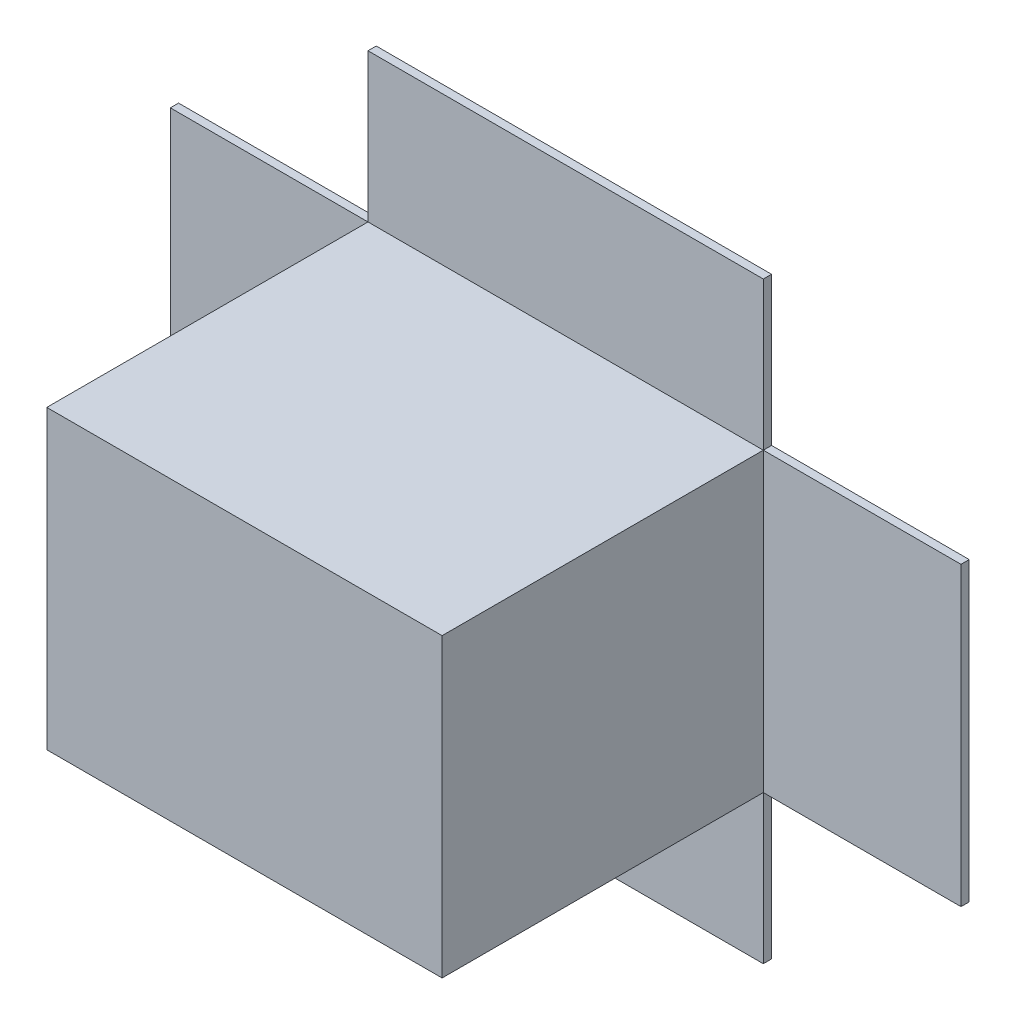
ISO-10303-21;
HEADER;
FILE_DESCRIPTION(('STEP AP214'),'2;1');
FILE_NAME('part.step','',(''),(''),'','','');
FILE_SCHEMA(('AUTOMOTIVE_DESIGN { 1 0 10303 214 1 1 1 1 }'));
ENDSEC;
DATA;
#1=APPLICATION_CONTEXT('core data for automotive mechanical design processes');
#2=APPLICATION_PROTOCOL_DEFINITION('international standard','automotive_design',2000,#1);
#3=PRODUCT_CONTEXT('',#1,'mechanical');
#4=PRODUCT('Part','Part','',(#3));
#5=PRODUCT_RELATED_PRODUCT_CATEGORY('part','',(#4));
#6=PRODUCT_DEFINITION_FORMATION('','',#4);
#7=PRODUCT_DEFINITION_CONTEXT('part definition',#1,'design');
#8=PRODUCT_DEFINITION('design','',#6,#7);
#9=PRODUCT_DEFINITION_SHAPE('','',#8);
#10=(LENGTH_UNIT() NAMED_UNIT(*) SI_UNIT(.MILLI.,.METRE.));
#11=(NAMED_UNIT(*) PLANE_ANGLE_UNIT() SI_UNIT($,.RADIAN.));
#12=(NAMED_UNIT(*) SI_UNIT($,.STERADIAN.) SOLID_ANGLE_UNIT());
#13=UNCERTAINTY_MEASURE_WITH_UNIT(LENGTH_MEASURE(1.E-05),#10,'distance_accuracy_value','');
#14=(GEOMETRIC_REPRESENTATION_CONTEXT(3) GLOBAL_UNCERTAINTY_ASSIGNED_CONTEXT((#13)) GLOBAL_UNIT_ASSIGNED_CONTEXT((#10,
#11,#12)) REPRESENTATION_CONTEXT('',''));
#15=CARTESIAN_POINT('',(0.,0.,0.));
#16=DIRECTION('',(0.,0.,1.));
#17=DIRECTION('',(1.,0.,0.));
#18=AXIS2_PLACEMENT_3D('',#15,#16,#17);
#19=CARTESIAN_POINT('',(0.,0.,0.));
#20=DIRECTION('',(0.,0.,-1.));
#21=DIRECTION('',(-1.,0.,0.));
#22=AXIS2_PLACEMENT_3D('',#19,#20,#21);
#23=PLANE('',#22);
#24=DIRECTION('',(1.,0.,0.));
#25=VECTOR('',#24,1.);
#26=CARTESIAN_POINT('',(-57.5,42.5,0.));
#27=LINE('',#26,#25);
#28=CARTESIAN_POINT('',(-57.5,42.5,0.));
#29=VERTEX_POINT('',#28);
#30=CARTESIAN_POINT('',(57.5,42.5,0.));
#31=VERTEX_POINT('',#30);
#32=EDGE_CURVE('E319',#29,#31,#27,.T.);
#33=ORIENTED_EDGE('',*,*,#32,.F.);
#34=DIRECTION('',(0.,1.,0.));
#35=VECTOR('',#34,1.);
#36=CARTESIAN_POINT('',(-57.5,-42.5,0.));
#37=LINE('',#36,#35);
#38=CARTESIAN_POINT('',(-57.5,-42.5,0.));
#39=VERTEX_POINT('',#38);
#40=EDGE_CURVE('E325',#39,#29,#37,.T.);
#41=ORIENTED_EDGE('',*,*,#40,.F.);
#42=DIRECTION('',(-1.,0.,0.));
#43=VECTOR('',#42,1.);
#44=CARTESIAN_POINT('',(57.5,-42.5,0.));
#45=LINE('',#44,#43);
#46=CARTESIAN_POINT('',(57.5,-42.5,0.));
#47=VERTEX_POINT('',#46);
#48=EDGE_CURVE('E345',#47,#39,#45,.T.);
#49=ORIENTED_EDGE('',*,*,#48,.F.);
#50=DIRECTION('',(0.,-1.,0.));
#51=VECTOR('',#50,1.);
#52=CARTESIAN_POINT('',(57.5,42.5,0.));
#53=LINE('',#52,#51);
#54=EDGE_CURVE('E341',#31,#47,#53,.T.);
#55=ORIENTED_EDGE('',*,*,#54,.F.);
#56=EDGE_LOOP('',(#33,#41,#49,#55));
#57=FACE_BOUND('',#56,.T.);
#58=DIRECTION('',(0.,1.,0.));
#59=VECTOR('',#58,1.);
#60=CARTESIAN_POINT('',(60.,0.,0.));
#61=LINE('',#60,#59);
#62=CARTESIAN_POINT('',(60.,45.,0.));
#63=VERTEX_POINT('',#62);
#64=CARTESIAN_POINT('',(60.,90.,0.));
#65=VERTEX_POINT('',#64);
#66=EDGE_CURVE('E201',#63,#65,#61,.T.);
#67=ORIENTED_EDGE('',*,*,#66,.F.);
#68=DIRECTION('',(1.,0.,0.));
#69=VECTOR('',#68,1.);
#70=CARTESIAN_POINT('',(0.,45.,0.));
#71=LINE('',#70,#69);
#72=CARTESIAN_POINT('',(120.,45.,0.));
#73=VERTEX_POINT('',#72);
#74=EDGE_CURVE('E197',#63,#73,#71,.T.);
#75=ORIENTED_EDGE('',*,*,#74,.T.);
#76=DIRECTION('',(0.,1.,0.));
#77=VECTOR('',#76,1.);
#78=CARTESIAN_POINT('',(120.,0.,0.));
#79=LINE('',#78,#77);
#80=CARTESIAN_POINT('',(120.,-45.,0.));
#81=VERTEX_POINT('',#80);
#82=EDGE_CURVE('E236',#81,#73,#79,.T.);
#83=ORIENTED_EDGE('',*,*,#82,.F.);
#84=DIRECTION('',(1.,0.,0.));
#85=VECTOR('',#84,1.);
#86=CARTESIAN_POINT('',(0.,-45.,0.));
#87=LINE('',#86,#85);
#88=CARTESIAN_POINT('',(60.,-45.,0.));
#89=VERTEX_POINT('',#88);
#90=EDGE_CURVE('E185',#89,#81,#87,.T.);
#91=ORIENTED_EDGE('',*,*,#90,.F.);
#92=DIRECTION('',(0.,-1.,0.));
#93=VECTOR('',#92,1.);
#94=CARTESIAN_POINT('',(60.,0.,0.));
#95=LINE('',#94,#93);
#96=CARTESIAN_POINT('',(60.,-90.,0.));
#97=VERTEX_POINT('',#96);
#98=EDGE_CURVE('E241',#89,#97,#95,.T.);
#99=ORIENTED_EDGE('',*,*,#98,.T.);
#100=DIRECTION('',(-1.,0.,0.));
#101=VECTOR('',#100,1.);
#102=CARTESIAN_POINT('',(0.,-90.,0.));
#103=LINE('',#102,#101);
#104=CARTESIAN_POINT('',(-60.,-90.,0.));
#105=VERTEX_POINT('',#104);
#106=EDGE_CURVE('E245',#97,#105,#103,.T.);
#107=ORIENTED_EDGE('',*,*,#106,.T.);
#108=DIRECTION('',(0.,-1.,0.));
#109=VECTOR('',#108,1.);
#110=CARTESIAN_POINT('',(-60.,0.,0.));
#111=LINE('',#110,#109);
#112=CARTESIAN_POINT('',(-60.,-45.,0.));
#113=VERTEX_POINT('',#112);
#114=EDGE_CURVE('E249',#113,#105,#111,.T.);
#115=ORIENTED_EDGE('',*,*,#114,.F.);
#116=DIRECTION('',(-1.,0.,0.));
#117=VECTOR('',#116,1.);
#118=CARTESIAN_POINT('',(0.,-45.,0.));
#119=LINE('',#118,#117);
#120=CARTESIAN_POINT('',(-120.,-45.,0.));
#121=VERTEX_POINT('',#120);
#122=EDGE_CURVE('E253',#113,#121,#119,.T.);
#123=ORIENTED_EDGE('',*,*,#122,.T.);
#124=DIRECTION('',(0.,-1.,0.));
#125=VECTOR('',#124,1.);
#126=CARTESIAN_POINT('',(-120.,0.,0.));
#127=LINE('',#126,#125);
#128=CARTESIAN_POINT('',(-120.,45.,0.));
#129=VERTEX_POINT('',#128);
#130=EDGE_CURVE('E257',#129,#121,#127,.T.);
#131=ORIENTED_EDGE('',*,*,#130,.F.);
#132=DIRECTION('',(-1.,0.,0.));
#133=VECTOR('',#132,1.);
#134=CARTESIAN_POINT('',(0.,45.,0.));
#135=LINE('',#134,#133);
#136=CARTESIAN_POINT('',(-60.,45.,0.));
#137=VERTEX_POINT('',#136);
#138=EDGE_CURVE('E261',#137,#129,#135,.T.);
#139=ORIENTED_EDGE('',*,*,#138,.F.);
#140=DIRECTION('',(0.,1.,0.));
#141=VECTOR('',#140,1.);
#142=CARTESIAN_POINT('',(-60.,0.,0.));
#143=LINE('',#142,#141);
#144=CARTESIAN_POINT('',(-60.,90.,0.));
#145=VERTEX_POINT('',#144);
#146=EDGE_CURVE('E264',#137,#145,#143,.T.);
#147=ORIENTED_EDGE('',*,*,#146,.T.);
#148=DIRECTION('',(-1.,0.,0.));
#149=VECTOR('',#148,1.);
#150=CARTESIAN_POINT('',(0.,90.,0.));
#151=LINE('',#150,#149);
#152=EDGE_CURVE('E268',#65,#145,#151,.T.);
#153=ORIENTED_EDGE('',*,*,#152,.F.);
#154=EDGE_LOOP('',(#67,#75,#83,#91,#99,#107,#115,#123,#131,#139,#147,#153));
#155=FACE_BOUND('',#154,.T.);
#156=ADVANCED_FACE('F41',(#57,#155),#23,.T.);
#157=CARTESIAN_POINT('',(-57.5,42.5,97.5));
#158=DIRECTION('',(0.,1.,0.));
#159=DIRECTION('',(0.,0.,1.));
#160=AXIS2_PLACEMENT_3D('',#157,#158,#159);
#161=PLANE('',#160);
#162=ORIENTED_EDGE('',*,*,#32,.T.);
#163=DIRECTION('',(0.,0.,-1.));
#164=VECTOR('',#163,1.);
#165=CARTESIAN_POINT('',(57.5,42.5,97.5));
#166=LINE('',#165,#164);
#167=CARTESIAN_POINT('',(57.5,42.5,97.5));
#168=VERTEX_POINT('',#167);
#169=EDGE_CURVE('E337',#168,#31,#166,.T.);
#170=ORIENTED_EDGE('',*,*,#169,.F.);
#171=DIRECTION('',(1.,0.,0.));
#172=VECTOR('',#171,1.);
#173=CARTESIAN_POINT('',(-57.5,42.5,97.5));
#174=LINE('',#173,#172);
#175=CARTESIAN_POINT('',(-57.5,42.5,97.5));
#176=VERTEX_POINT('',#175);
#177=EDGE_CURVE('E320',#176,#168,#174,.T.);
#178=ORIENTED_EDGE('',*,*,#177,.F.);
#179=DIRECTION('',(0.,0.,-1.));
#180=VECTOR('',#179,1.);
#181=CARTESIAN_POINT('',(-57.5,42.5,97.5));
#182=LINE('',#181,#180);
#183=EDGE_CURVE('E352',#176,#29,#182,.T.);
#184=ORIENTED_EDGE('',*,*,#183,.T.);
#185=EDGE_LOOP('',(#162,#170,#178,#184));
#186=FACE_BOUND('',#185,.T.);
#187=ADVANCED_FACE('F444',(#186),#161,.F.);
#188=CARTESIAN_POINT('',(-57.5,-42.5,97.5));
#189=DIRECTION('',(-1.,0.,0.));
#190=DIRECTION('',(0.,0.,1.));
#191=AXIS2_PLACEMENT_3D('',#188,#189,#190);
#192=PLANE('',#191);
#193=ORIENTED_EDGE('',*,*,#40,.T.);
#194=ORIENTED_EDGE('',*,*,#183,.F.);
#195=DIRECTION('',(0.,1.,0.));
#196=VECTOR('',#195,1.);
#197=CARTESIAN_POINT('',(-57.5,-42.5,97.5));
#198=LINE('',#197,#196);
#199=CARTESIAN_POINT('',(-57.5,-42.5,97.5));
#200=VERTEX_POINT('',#199);
#201=EDGE_CURVE('E333',#200,#176,#198,.T.);
#202=ORIENTED_EDGE('',*,*,#201,.F.);
#203=DIRECTION('',(0.,0.,-1.));
#204=VECTOR('',#203,1.);
#205=CARTESIAN_POINT('',(-57.5,-42.5,97.5));
#206=LINE('',#205,#204);
#207=EDGE_CURVE('E356',#200,#39,#206,.T.);
#208=ORIENTED_EDGE('',*,*,#207,.T.);
#209=EDGE_LOOP('',(#193,#194,#202,#208));
#210=FACE_BOUND('',#209,.T.);
#211=ADVANCED_FACE('F450',(#210),#192,.F.);
#212=CARTESIAN_POINT('',(57.5,-42.5,97.5));
#213=DIRECTION('',(0.,-1.,0.));
#214=DIRECTION('',(0.,0.,-1.));
#215=AXIS2_PLACEMENT_3D('',#212,#213,#214);
#216=PLANE('',#215);
#217=ORIENTED_EDGE('',*,*,#48,.T.);
#218=ORIENTED_EDGE('',*,*,#207,.F.);
#219=DIRECTION('',(-1.,0.,0.));
#220=VECTOR('',#219,1.);
#221=CARTESIAN_POINT('',(57.5,-42.5,97.5));
#222=LINE('',#221,#220);
#223=CARTESIAN_POINT('',(57.5,-42.5,97.5));
#224=VERTEX_POINT('',#223);
#225=EDGE_CURVE('E329',#224,#200,#222,.T.);
#226=ORIENTED_EDGE('',*,*,#225,.F.);
#227=DIRECTION('',(0.,0.,-1.));
#228=VECTOR('',#227,1.);
#229=CARTESIAN_POINT('',(57.5,-42.5,97.5));
#230=LINE('',#229,#228);
#231=EDGE_CURVE('E359',#224,#47,#230,.T.);
#232=ORIENTED_EDGE('',*,*,#231,.T.);
#233=EDGE_LOOP('',(#217,#218,#226,#232));
#234=FACE_BOUND('',#233,.T.);
#235=ADVANCED_FACE('F483',(#234),#216,.F.);
#236=CARTESIAN_POINT('',(57.5,42.5,97.5));
#237=DIRECTION('',(1.,0.,0.));
#238=DIRECTION('',(0.,0.,-1.));
#239=AXIS2_PLACEMENT_3D('',#236,#237,#238);
#240=PLANE('',#239);
#241=ORIENTED_EDGE('',*,*,#54,.T.);
#242=ORIENTED_EDGE('',*,*,#231,.F.);
#243=DIRECTION('',(0.,-1.,0.));
#244=VECTOR('',#243,1.);
#245=CARTESIAN_POINT('',(57.5,42.5,97.5));
#246=LINE('',#245,#244);
#247=EDGE_CURVE('E324',#168,#224,#246,.T.);
#248=ORIENTED_EDGE('',*,*,#247,.F.);
#249=ORIENTED_EDGE('',*,*,#169,.T.);
#250=EDGE_LOOP('',(#241,#242,#248,#249));
#251=FACE_BOUND('',#250,.T.);
#252=ADVANCED_FACE('F479',(#251),#240,.F.);
#253=CARTESIAN_POINT('',(0.,0.,97.5));
#254=DIRECTION('',(0.,0.,-1.));
#255=DIRECTION('',(-1.,0.,0.));
#256=AXIS2_PLACEMENT_3D('',#253,#254,#255);
#257=PLANE('',#256);
#258=ORIENTED_EDGE('',*,*,#177,.T.);
#259=ORIENTED_EDGE('',*,*,#247,.T.);
#260=ORIENTED_EDGE('',*,*,#225,.T.);
#261=ORIENTED_EDGE('',*,*,#201,.T.);
#262=EDGE_LOOP('',(#258,#259,#260,#261));
#263=FACE_BOUND('',#262,.T.);
#264=ADVANCED_FACE('F476',(#263),#257,.T.);
#265=CARTESIAN_POINT('',(0.,0.,2.5));
#266=DIRECTION('',(0.,0.,-1.));
#267=DIRECTION('',(-1.,0.,0.));
#268=AXIS2_PLACEMENT_3D('',#265,#266,#267);
#269=PLANE('',#268);
#270=DIRECTION('',(1.,0.,0.));
#271=VECTOR('',#270,1.);
#272=CARTESIAN_POINT('',(0.,45.,2.5));
#273=LINE('',#272,#271);
#274=CARTESIAN_POINT('',(60.,45.,2.5));
#275=VERTEX_POINT('',#274);
#276=CARTESIAN_POINT('',(120.,45.,2.5));
#277=VERTEX_POINT('',#276);
#278=EDGE_CURVE('E191',#275,#277,#273,.T.);
#279=ORIENTED_EDGE('',*,*,#278,.F.);
#280=DIRECTION('',(0.,-1.,0.));
#281=VECTOR('',#280,1.);
#282=CARTESIAN_POINT('',(60.,-45.,2.5));
#283=LINE('',#282,#281);
#284=CARTESIAN_POINT('',(60.,-45.,2.5));
#285=VERTEX_POINT('',#284);
#286=EDGE_CURVE('E57',#275,#285,#283,.T.);
#287=ORIENTED_EDGE('',*,*,#286,.T.);
#288=DIRECTION('',(1.,0.,0.));
#289=VECTOR('',#288,1.);
#290=CARTESIAN_POINT('',(0.,-45.,2.5));
#291=LINE('',#290,#289);
#292=CARTESIAN_POINT('',(120.,-45.,2.5));
#293=VERTEX_POINT('',#292);
#294=EDGE_CURVE('E168',#285,#293,#291,.T.);
#295=ORIENTED_EDGE('',*,*,#294,.T.);
#296=DIRECTION('',(0.,1.,0.));
#297=VECTOR('',#296,1.);
#298=CARTESIAN_POINT('',(120.,0.,2.5));
#299=LINE('',#298,#297);
#300=EDGE_CURVE('E173',#293,#277,#299,.T.);
#301=ORIENTED_EDGE('',*,*,#300,.T.);
#302=EDGE_LOOP('',(#279,#287,#295,#301));
#303=FACE_BOUND('',#302,.T.);
#304=ADVANCED_FACE('F171',(#303),#269,.F.);
#305=DIRECTION('',(0.,1.,0.));
#306=VECTOR('',#305,1.);
#307=CARTESIAN_POINT('',(-60.,0.,2.5));
#308=LINE('',#307,#306);
#309=CARTESIAN_POINT('',(-60.,45.,2.5));
#310=VERTEX_POINT('',#309);
#311=CARTESIAN_POINT('',(-60.,90.,2.5));
#312=VERTEX_POINT('',#311);
#313=EDGE_CURVE('E224',#310,#312,#308,.T.);
#314=ORIENTED_EDGE('',*,*,#313,.F.);
#315=DIRECTION('',(1.,0.,0.));
#316=VECTOR('',#315,1.);
#317=CARTESIAN_POINT('',(-60.,45.,2.5));
#318=LINE('',#317,#316);
#319=EDGE_CURVE('E63',#310,#275,#318,.T.);
#320=ORIENTED_EDGE('',*,*,#319,.T.);
#321=DIRECTION('',(0.,1.,0.));
#322=VECTOR('',#321,1.);
#323=CARTESIAN_POINT('',(60.,0.,2.5));
#324=LINE('',#323,#322);
#325=CARTESIAN_POINT('',(60.,90.,2.5));
#326=VERTEX_POINT('',#325);
#327=EDGE_CURVE('E231',#275,#326,#324,.T.);
#328=ORIENTED_EDGE('',*,*,#327,.T.);
#329=DIRECTION('',(-1.,0.,0.));
#330=VECTOR('',#329,1.);
#331=CARTESIAN_POINT('',(0.,90.,2.5));
#332=LINE('',#331,#330);
#333=EDGE_CURVE('E228',#326,#312,#332,.T.);
#334=ORIENTED_EDGE('',*,*,#333,.T.);
#335=EDGE_LOOP('',(#314,#320,#328,#334));
#336=FACE_BOUND('',#335,.T.);
#337=ADVANCED_FACE('F402',(#336),#269,.F.);
#338=DIRECTION('',(-1.,0.,0.));
#339=VECTOR('',#338,1.);
#340=CARTESIAN_POINT('',(0.,-45.,2.5));
#341=LINE('',#340,#339);
#342=CARTESIAN_POINT('',(-60.,-45.,2.5));
#343=VERTEX_POINT('',#342);
#344=CARTESIAN_POINT('',(-120.,-45.,2.5));
#345=VERTEX_POINT('',#344);
#346=EDGE_CURVE('E214',#343,#345,#341,.T.);
#347=ORIENTED_EDGE('',*,*,#346,.F.);
#348=DIRECTION('',(0.,1.,0.));
#349=VECTOR('',#348,1.);
#350=CARTESIAN_POINT('',(-60.,-45.,2.5));
#351=LINE('',#350,#349);
#352=EDGE_CURVE('E311',#343,#310,#351,.T.);
#353=ORIENTED_EDGE('',*,*,#352,.T.);
#354=DIRECTION('',(-1.,0.,0.));
#355=VECTOR('',#354,1.);
#356=CARTESIAN_POINT('',(0.,45.,2.5));
#357=LINE('',#356,#355);
#358=CARTESIAN_POINT('',(-120.,45.,2.5));
#359=VERTEX_POINT('',#358);
#360=EDGE_CURVE('E221',#310,#359,#357,.T.);
#361=ORIENTED_EDGE('',*,*,#360,.T.);
#362=DIRECTION('',(0.,-1.,0.));
#363=VECTOR('',#362,1.);
#364=CARTESIAN_POINT('',(-120.,0.,2.5));
#365=LINE('',#364,#363);
#366=EDGE_CURVE('E218',#359,#345,#365,.T.);
#367=ORIENTED_EDGE('',*,*,#366,.T.);
#368=EDGE_LOOP('',(#347,#353,#361,#367));
#369=FACE_BOUND('',#368,.T.);
#370=ADVANCED_FACE('F390',(#369),#269,.F.);
#371=DIRECTION('',(0.,-1.,0.));
#372=VECTOR('',#371,1.);
#373=CARTESIAN_POINT('',(60.,0.,2.5));
#374=LINE('',#373,#372);
#375=CARTESIAN_POINT('',(60.,-90.,2.5));
#376=VERTEX_POINT('',#375);
#377=EDGE_CURVE('E179',#285,#376,#374,.T.);
#378=ORIENTED_EDGE('',*,*,#377,.F.);
#379=DIRECTION('',(-1.,0.,0.));
#380=VECTOR('',#379,1.);
#381=CARTESIAN_POINT('',(-60.,-45.,2.5));
#382=LINE('',#381,#380);
#383=EDGE_CURVE('E276',#285,#343,#382,.T.);
#384=ORIENTED_EDGE('',*,*,#383,.T.);
#385=DIRECTION('',(0.,-1.,0.));
#386=VECTOR('',#385,1.);
#387=CARTESIAN_POINT('',(-60.,0.,2.5));
#388=LINE('',#387,#386);
#389=CARTESIAN_POINT('',(-60.,-90.,2.5));
#390=VERTEX_POINT('',#389);
#391=EDGE_CURVE('E211',#343,#390,#388,.T.);
#392=ORIENTED_EDGE('',*,*,#391,.T.);
#393=DIRECTION('',(-1.,0.,0.));
#394=VECTOR('',#393,1.);
#395=CARTESIAN_POINT('',(0.,-90.,2.5));
#396=LINE('',#395,#394);
#397=EDGE_CURVE('E207',#376,#390,#396,.T.);
#398=ORIENTED_EDGE('',*,*,#397,.F.);
#399=EDGE_LOOP('',(#378,#384,#392,#398));
#400=FACE_BOUND('',#399,.T.);
#401=ADVANCED_FACE('F428',(#400),#269,.F.);
#402=CARTESIAN_POINT('',(120.,0.,2.5));
#403=DIRECTION('',(-1.,0.,0.));
#404=DIRECTION('',(0.,0.,1.));
#405=AXIS2_PLACEMENT_3D('',#402,#403,#404);
#406=PLANE('',#405);
#407=ORIENTED_EDGE('',*,*,#82,.T.);
#408=DIRECTION('',(0.,0.,-1.));
#409=VECTOR('',#408,1.);
#410=CARTESIAN_POINT('',(120.,45.,2.5));
#411=LINE('',#410,#409);
#412=EDGE_CURVE('E194',#277,#73,#411,.T.);
#413=ORIENTED_EDGE('',*,*,#412,.F.);
#414=ORIENTED_EDGE('',*,*,#300,.F.);
#415=DIRECTION('',(0.,0.,-1.));
#416=VECTOR('',#415,1.);
#417=CARTESIAN_POINT('',(120.,-45.,2.5));
#418=LINE('',#417,#416);
#419=EDGE_CURVE('E182',#293,#81,#418,.T.);
#420=ORIENTED_EDGE('',*,*,#419,.T.);
#421=EDGE_LOOP('',(#407,#413,#414,#420));
#422=FACE_BOUND('',#421,.T.);
#423=ADVANCED_FACE('F193',(#422),#406,.F.);
#424=CARTESIAN_POINT('',(0.,45.,2.5));
#425=DIRECTION('',(0.,1.,0.));
#426=DIRECTION('',(-1.,0.,0.));
#427=AXIS2_PLACEMENT_3D('',#424,#425,#426);
#428=PLANE('',#427);
#429=ORIENTED_EDGE('',*,*,#74,.F.);
#430=DIRECTION('',(0.,0.,-1.));
#431=VECTOR('',#430,1.);
#432=CARTESIAN_POINT('',(60.,45.,2.5));
#433=LINE('',#432,#431);
#434=EDGE_CURVE('E277',#275,#63,#433,.T.);
#435=ORIENTED_EDGE('',*,*,#434,.F.);
#436=ORIENTED_EDGE('',*,*,#278,.T.);
#437=ORIENTED_EDGE('',*,*,#412,.T.);
#438=EDGE_LOOP('',(#429,#435,#436,#437));
#439=FACE_BOUND('',#438,.T.);
#440=ADVANCED_FACE('F475',(#439),#428,.T.);
#441=CARTESIAN_POINT('',(60.,0.,2.5));
#442=DIRECTION('',(-1.,0.,0.));
#443=DIRECTION('',(0.,0.,1.));
#444=AXIS2_PLACEMENT_3D('',#441,#442,#443);
#445=PLANE('',#444);
#446=ORIENTED_EDGE('',*,*,#66,.T.);
#447=DIRECTION('',(0.,0.,-1.));
#448=VECTOR('',#447,1.);
#449=CARTESIAN_POINT('',(60.,90.,2.5));
#450=LINE('',#449,#448);
#451=EDGE_CURVE('E280',#326,#65,#450,.T.);
#452=ORIENTED_EDGE('',*,*,#451,.F.);
#453=ORIENTED_EDGE('',*,*,#327,.F.);
#454=ORIENTED_EDGE('',*,*,#434,.T.);
#455=EDGE_LOOP('',(#446,#452,#453,#454));
#456=FACE_BOUND('',#455,.T.);
#457=ADVANCED_FACE('F536',(#456),#445,.F.);
#458=CARTESIAN_POINT('',(0.,90.,2.5));
#459=DIRECTION('',(0.,-1.,0.));
#460=DIRECTION('',(0.,0.,-1.));
#461=AXIS2_PLACEMENT_3D('',#458,#459,#460);
#462=PLANE('',#461);
#463=ORIENTED_EDGE('',*,*,#152,.T.);
#464=DIRECTION('',(0.,0.,-1.));
#465=VECTOR('',#464,1.);
#466=CARTESIAN_POINT('',(-60.,90.,2.5));
#467=LINE('',#466,#465);
#468=EDGE_CURVE('E284',#312,#145,#467,.T.);
#469=ORIENTED_EDGE('',*,*,#468,.F.);
#470=ORIENTED_EDGE('',*,*,#333,.F.);
#471=ORIENTED_EDGE('',*,*,#451,.T.);
#472=EDGE_LOOP('',(#463,#469,#470,#471));
#473=FACE_BOUND('',#472,.T.);
#474=ADVANCED_FACE('F409',(#473),#462,.F.);
#475=CARTESIAN_POINT('',(-60.,0.,2.5));
#476=DIRECTION('',(-1.,0.,0.));
#477=DIRECTION('',(0.,-1.,0.));
#478=AXIS2_PLACEMENT_3D('',#475,#476,#477);
#479=PLANE('',#478);
#480=ORIENTED_EDGE('',*,*,#146,.F.);
#481=DIRECTION('',(0.,0.,-1.));
#482=VECTOR('',#481,1.);
#483=CARTESIAN_POINT('',(-60.,45.,2.5));
#484=LINE('',#483,#482);
#485=EDGE_CURVE('E287',#310,#137,#484,.T.);
#486=ORIENTED_EDGE('',*,*,#485,.F.);
#487=ORIENTED_EDGE('',*,*,#313,.T.);
#488=ORIENTED_EDGE('',*,*,#468,.T.);
#489=EDGE_LOOP('',(#480,#486,#487,#488));
#490=FACE_BOUND('',#489,.T.);
#491=ADVANCED_FACE('F395',(#490),#479,.T.);
#492=CARTESIAN_POINT('',(0.,45.,2.5));
#493=DIRECTION('',(0.,-1.,0.));
#494=DIRECTION('',(0.,0.,-1.));
#495=AXIS2_PLACEMENT_3D('',#492,#493,#494);
#496=PLANE('',#495);
#497=ORIENTED_EDGE('',*,*,#138,.T.);
#498=DIRECTION('',(0.,0.,-1.));
#499=VECTOR('',#498,1.);
#500=CARTESIAN_POINT('',(-120.,45.,2.5));
#501=LINE('',#500,#499);
#502=EDGE_CURVE('E290',#359,#129,#501,.T.);
#503=ORIENTED_EDGE('',*,*,#502,.F.);
#504=ORIENTED_EDGE('',*,*,#360,.F.);
#505=ORIENTED_EDGE('',*,*,#485,.T.);
#506=EDGE_LOOP('',(#497,#503,#504,#505));
#507=FACE_BOUND('',#506,.T.);
#508=ADVANCED_FACE('F399',(#507),#496,.F.);
#509=CARTESIAN_POINT('',(-120.,0.,2.5));
#510=DIRECTION('',(1.,0.,0.));
#511=DIRECTION('',(0.,0.,-1.));
#512=AXIS2_PLACEMENT_3D('',#509,#510,#511);
#513=PLANE('',#512);
#514=ORIENTED_EDGE('',*,*,#130,.T.);
#515=DIRECTION('',(0.,0.,-1.));
#516=VECTOR('',#515,1.);
#517=CARTESIAN_POINT('',(-120.,-45.,2.5));
#518=LINE('',#517,#516);
#519=EDGE_CURVE('E294',#345,#121,#518,.T.);
#520=ORIENTED_EDGE('',*,*,#519,.F.);
#521=ORIENTED_EDGE('',*,*,#366,.F.);
#522=ORIENTED_EDGE('',*,*,#502,.T.);
#523=EDGE_LOOP('',(#514,#520,#521,#522));
#524=FACE_BOUND('',#523,.T.);
#525=ADVANCED_FACE('F415',(#524),#513,.F.);
#526=CARTESIAN_POINT('',(0.,-45.,2.5));
#527=DIRECTION('',(0.,-1.,0.));
#528=DIRECTION('',(0.,0.,-1.));
#529=AXIS2_PLACEMENT_3D('',#526,#527,#528);
#530=PLANE('',#529);
#531=ORIENTED_EDGE('',*,*,#122,.F.);
#532=DIRECTION('',(0.,0.,-1.));
#533=VECTOR('',#532,1.);
#534=CARTESIAN_POINT('',(-60.,-45.,2.5));
#535=LINE('',#534,#533);
#536=EDGE_CURVE('E297',#343,#113,#535,.T.);
#537=ORIENTED_EDGE('',*,*,#536,.F.);
#538=ORIENTED_EDGE('',*,*,#346,.T.);
#539=ORIENTED_EDGE('',*,*,#519,.T.);
#540=EDGE_LOOP('',(#531,#537,#538,#539));
#541=FACE_BOUND('',#540,.T.);
#542=ADVANCED_FACE('F420',(#541),#530,.T.);
#543=CARTESIAN_POINT('',(-60.,0.,2.5));
#544=DIRECTION('',(1.,0.,0.));
#545=DIRECTION('',(0.,1.,0.));
#546=AXIS2_PLACEMENT_3D('',#543,#544,#545);
#547=PLANE('',#546);
#548=ORIENTED_EDGE('',*,*,#114,.T.);
#549=DIRECTION('',(0.,0.,-1.));
#550=VECTOR('',#549,1.);
#551=CARTESIAN_POINT('',(-60.,-90.,2.5));
#552=LINE('',#551,#550);
#553=EDGE_CURVE('E300',#390,#105,#552,.T.);
#554=ORIENTED_EDGE('',*,*,#553,.F.);
#555=ORIENTED_EDGE('',*,*,#391,.F.);
#556=ORIENTED_EDGE('',*,*,#536,.T.);
#557=EDGE_LOOP('',(#548,#554,#555,#556));
#558=FACE_BOUND('',#557,.T.);
#559=ADVANCED_FACE('F425',(#558),#547,.F.);
#560=CARTESIAN_POINT('',(0.,-90.,2.5));
#561=DIRECTION('',(0.,-1.,0.));
#562=DIRECTION('',(0.,0.,-1.));
#563=AXIS2_PLACEMENT_3D('',#560,#561,#562);
#564=PLANE('',#563);
#565=ORIENTED_EDGE('',*,*,#106,.F.);
#566=DIRECTION('',(0.,0.,-1.));
#567=VECTOR('',#566,1.);
#568=CARTESIAN_POINT('',(60.,-90.,2.5));
#569=LINE('',#568,#567);
#570=EDGE_CURVE('E303',#376,#97,#569,.T.);
#571=ORIENTED_EDGE('',*,*,#570,.F.);
#572=ORIENTED_EDGE('',*,*,#397,.T.);
#573=ORIENTED_EDGE('',*,*,#553,.T.);
#574=EDGE_LOOP('',(#565,#571,#572,#573));
#575=FACE_BOUND('',#574,.T.);
#576=ADVANCED_FACE('F468',(#575),#564,.T.);
#577=CARTESIAN_POINT('',(60.,0.,2.5));
#578=DIRECTION('',(1.,0.,0.));
#579=DIRECTION('',(0.,0.,-1.));
#580=AXIS2_PLACEMENT_3D('',#577,#578,#579);
#581=PLANE('',#580);
#582=ORIENTED_EDGE('',*,*,#98,.F.);
#583=DIRECTION('',(0.,0.,-1.));
#584=VECTOR('',#583,1.);
#585=CARTESIAN_POINT('',(60.,-45.,2.5));
#586=LINE('',#585,#584);
#587=EDGE_CURVE('E190',#285,#89,#586,.T.);
#588=ORIENTED_EDGE('',*,*,#587,.F.);
#589=ORIENTED_EDGE('',*,*,#377,.T.);
#590=ORIENTED_EDGE('',*,*,#570,.T.);
#591=EDGE_LOOP('',(#582,#588,#589,#590));
#592=FACE_BOUND('',#591,.T.);
#593=ADVANCED_FACE('F463',(#592),#581,.T.);
#594=CARTESIAN_POINT('',(0.,-45.,2.5));
#595=DIRECTION('',(0.,1.,0.));
#596=DIRECTION('',(-1.,0.,0.));
#597=AXIS2_PLACEMENT_3D('',#594,#595,#596);
#598=PLANE('',#597);
#599=ORIENTED_EDGE('',*,*,#90,.T.);
#600=ORIENTED_EDGE('',*,*,#419,.F.);
#601=ORIENTED_EDGE('',*,*,#294,.F.);
#602=ORIENTED_EDGE('',*,*,#587,.T.);
#603=EDGE_LOOP('',(#599,#600,#601,#602));
#604=FACE_BOUND('',#603,.T.);
#605=ADVANCED_FACE('F183',(#604),#598,.F.);
#606=CARTESIAN_POINT('',(0.,0.,100.));
#607=DIRECTION('',(0.,0.,-1.));
#608=DIRECTION('',(-1.,0.,0.));
#609=AXIS2_PLACEMENT_3D('',#606,#607,#608);
#610=PLANE('',#609);
#611=DIRECTION('',(0.,1.,0.));
#612=VECTOR('',#611,1.);
#613=CARTESIAN_POINT('',(60.,-45.,100.));
#614=LINE('',#613,#612);
#615=CARTESIAN_POINT('',(60.,-45.,100.));
#616=VERTEX_POINT('',#615);
#617=CARTESIAN_POINT('',(60.,45.,100.));
#618=VERTEX_POINT('',#617);
#619=EDGE_CURVE('E355',#616,#618,#614,.T.);
#620=ORIENTED_EDGE('',*,*,#619,.T.);
#621=DIRECTION('',(-1.,0.,0.));
#622=VECTOR('',#621,1.);
#623=CARTESIAN_POINT('',(-60.,45.,100.));
#624=LINE('',#623,#622);
#625=CARTESIAN_POINT('',(-60.,45.,100.));
#626=VERTEX_POINT('',#625);
#627=EDGE_CURVE('E367',#618,#626,#624,.T.);
#628=ORIENTED_EDGE('',*,*,#627,.T.);
#629=DIRECTION('',(0.,-1.,0.));
#630=VECTOR('',#629,1.);
#631=CARTESIAN_POINT('',(-60.,-45.,100.));
#632=LINE('',#631,#630);
#633=CARTESIAN_POINT('',(-60.,-45.,100.));
#634=VERTEX_POINT('',#633);
#635=EDGE_CURVE('E370',#626,#634,#632,.T.);
#636=ORIENTED_EDGE('',*,*,#635,.T.);
#637=DIRECTION('',(1.,0.,0.));
#638=VECTOR('',#637,1.);
#639=CARTESIAN_POINT('',(-60.,-45.,100.));
#640=LINE('',#639,#638);
#641=EDGE_CURVE('E373',#634,#616,#640,.T.);
#642=ORIENTED_EDGE('',*,*,#641,.T.);
#643=EDGE_LOOP('',(#620,#628,#636,#642));
#644=FACE_BOUND('',#643,.T.);
#645=ADVANCED_FACE('F435',(#644),#610,.F.);
#646=CARTESIAN_POINT('',(-60.,-45.,100.));
#647=DIRECTION('',(0.,1.,0.));
#648=DIRECTION('',(0.,0.,1.));
#649=AXIS2_PLACEMENT_3D('',#646,#647,#648);
#650=PLANE('',#649);
#651=ORIENTED_EDGE('',*,*,#383,.F.);
#652=DIRECTION('',(0.,0.,-1.));
#653=VECTOR('',#652,1.);
#654=CARTESIAN_POINT('',(60.,-45.,100.));
#655=LINE('',#654,#653);
#656=EDGE_CURVE('E376',#616,#285,#655,.T.);
#657=ORIENTED_EDGE('',*,*,#656,.F.);
#658=ORIENTED_EDGE('',*,*,#641,.F.);
#659=DIRECTION('',(0.,0.,-1.));
#660=VECTOR('',#659,1.);
#661=CARTESIAN_POINT('',(-60.,-45.,100.));
#662=LINE('',#661,#660);
#663=EDGE_CURVE('E379',#634,#343,#662,.T.);
#664=ORIENTED_EDGE('',*,*,#663,.T.);
#665=EDGE_LOOP('',(#651,#657,#658,#664));
#666=FACE_BOUND('',#665,.T.);
#667=ADVANCED_FACE('F431',(#666),#650,.F.);
#668=CARTESIAN_POINT('',(-60.,-45.,100.));
#669=DIRECTION('',(1.,0.,0.));
#670=DIRECTION('',(0.,0.,-1.));
#671=AXIS2_PLACEMENT_3D('',#668,#669,#670);
#672=PLANE('',#671);
#673=ORIENTED_EDGE('',*,*,#352,.F.);
#674=ORIENTED_EDGE('',*,*,#663,.F.);
#675=ORIENTED_EDGE('',*,*,#635,.F.);
#676=DIRECTION('',(0.,0.,-1.));
#677=VECTOR('',#676,1.);
#678=CARTESIAN_POINT('',(-60.,45.,100.));
#679=LINE('',#678,#677);
#680=EDGE_CURVE('E50',#626,#310,#679,.T.);
#681=ORIENTED_EDGE('',*,*,#680,.T.);
#682=EDGE_LOOP('',(#673,#674,#675,#681));
#683=FACE_BOUND('',#682,.T.);
#684=ADVANCED_FACE('F385',(#683),#672,.F.);
#685=CARTESIAN_POINT('',(-60.,45.,100.));
#686=DIRECTION('',(0.,-1.,0.));
#687=DIRECTION('',(0.,0.,-1.));
#688=AXIS2_PLACEMENT_3D('',#685,#686,#687);
#689=PLANE('',#688);
#690=ORIENTED_EDGE('',*,*,#319,.F.);
#691=ORIENTED_EDGE('',*,*,#680,.F.);
#692=ORIENTED_EDGE('',*,*,#627,.F.);
#693=DIRECTION('',(0.,0.,-1.));
#694=VECTOR('',#693,1.);
#695=CARTESIAN_POINT('',(60.,45.,100.));
#696=LINE('',#695,#694);
#697=EDGE_CURVE('E11',#618,#275,#696,.T.);
#698=ORIENTED_EDGE('',*,*,#697,.T.);
#699=EDGE_LOOP('',(#690,#691,#692,#698));
#700=FACE_BOUND('',#699,.T.);
#701=ADVANCED_FACE('F436',(#700),#689,.F.);
#702=CARTESIAN_POINT('',(60.,-45.,100.));
#703=DIRECTION('',(-1.,0.,0.));
#704=DIRECTION('',(0.,0.,1.));
#705=AXIS2_PLACEMENT_3D('',#702,#703,#704);
#706=PLANE('',#705);
#707=ORIENTED_EDGE('',*,*,#286,.F.);
#708=ORIENTED_EDGE('',*,*,#697,.F.);
#709=ORIENTED_EDGE('',*,*,#619,.F.);
#710=ORIENTED_EDGE('',*,*,#656,.T.);
#711=EDGE_LOOP('',(#707,#708,#709,#710));
#712=FACE_BOUND('',#711,.T.);
#713=ADVANCED_FACE('F43',(#712),#706,.F.);
#714=CLOSED_SHELL('',(#156,#187,#211,#235,#252,#264,#304,#337,#370,#401,#423,#440,#457,#474,
#491,#508,#525,#542,#559,#576,#593,#605,#645,#667,#684,#701,#713));
#715=MANIFOLD_SOLID_BREP('B2',#714);
#716=ADVANCED_BREP_SHAPE_REPRESENTATION('',(#18,#715),#14);
#717=SHAPE_DEFINITION_REPRESENTATION(#9,#716);
ENDSEC;
END-ISO-10303-21;
